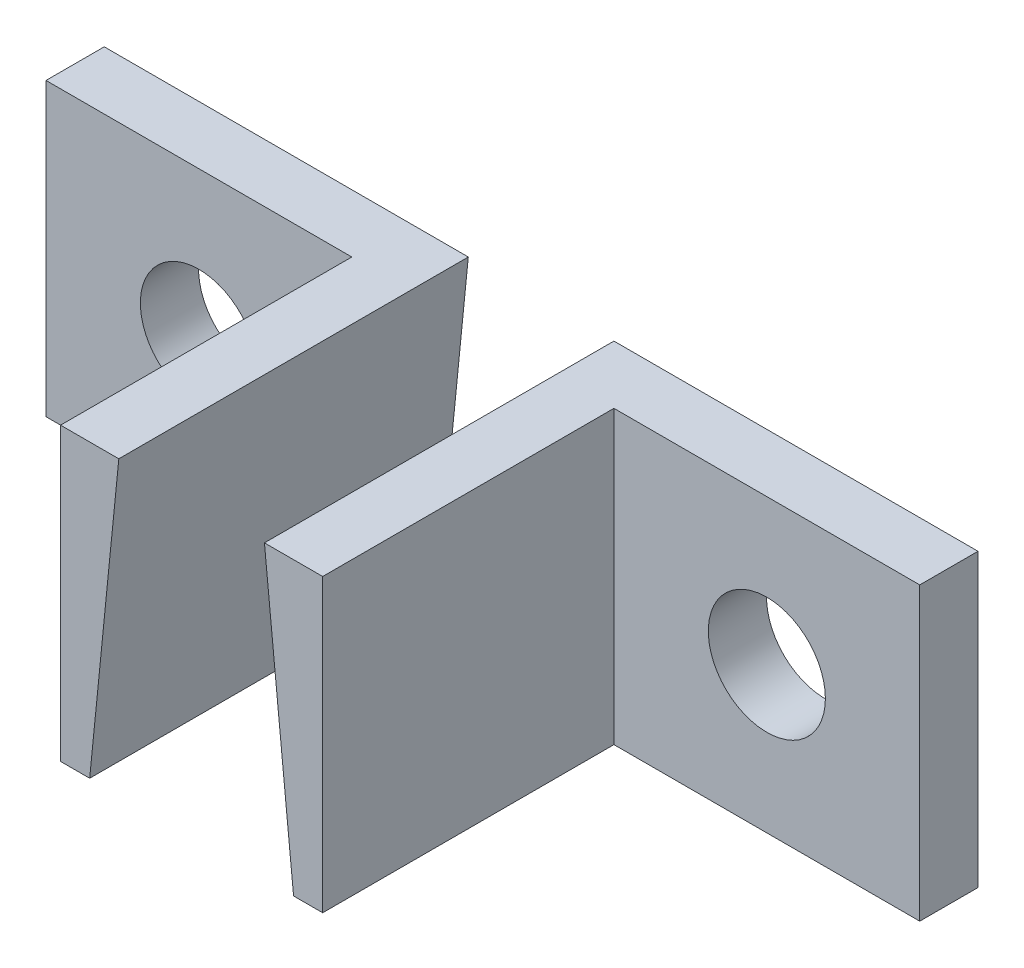
ISO-10303-21;
HEADER;
FILE_DESCRIPTION(('STEP AP214'),'2;1');
FILE_NAME('part.step','',(''),(''),'','','');
FILE_SCHEMA(('AUTOMOTIVE_DESIGN { 1 0 10303 214 1 1 1 1 }'));
ENDSEC;
DATA;
#1=APPLICATION_CONTEXT('core data for automotive mechanical design processes');
#2=APPLICATION_PROTOCOL_DEFINITION('international standard','automotive_design',2000,#1);
#3=PRODUCT_CONTEXT('',#1,'mechanical');
#4=PRODUCT('Part','Part','',(#3));
#5=PRODUCT_RELATED_PRODUCT_CATEGORY('part','',(#4));
#6=PRODUCT_DEFINITION_FORMATION('','',#4);
#7=PRODUCT_DEFINITION_CONTEXT('part definition',#1,'design');
#8=PRODUCT_DEFINITION('design','',#6,#7);
#9=PRODUCT_DEFINITION_SHAPE('','',#8);
#10=(LENGTH_UNIT() NAMED_UNIT(*) SI_UNIT(.MILLI.,.METRE.));
#11=(NAMED_UNIT(*) PLANE_ANGLE_UNIT() SI_UNIT($,.RADIAN.));
#12=(NAMED_UNIT(*) SI_UNIT($,.STERADIAN.) SOLID_ANGLE_UNIT());
#13=UNCERTAINTY_MEASURE_WITH_UNIT(LENGTH_MEASURE(1.E-05),#10,'distance_accuracy_value','');
#14=(GEOMETRIC_REPRESENTATION_CONTEXT(3) GLOBAL_UNCERTAINTY_ASSIGNED_CONTEXT((#13)) GLOBAL_UNIT_ASSIGNED_CONTEXT((#10,
#11,#12)) REPRESENTATION_CONTEXT('',''));
#15=CARTESIAN_POINT('',(0.,0.,0.));
#16=DIRECTION('',(0.,0.,1.));
#17=DIRECTION('',(1.,0.,0.));
#18=AXIS2_PLACEMENT_3D('',#15,#16,#17);
#19=CARTESIAN_POINT('',(0.,0.,0.));
#20=DIRECTION('',(0.,0.,1.));
#21=DIRECTION('',(1.,0.,0.));
#22=AXIS2_PLACEMENT_3D('',#19,#20,#21);
#23=PLANE('',#22);
#24=DIRECTION('',(-1.,0.,0.));
#25=VECTOR('',#24,1.);
#26=CARTESIAN_POINT('',(0.,12.7,0.));
#27=LINE('',#26,#25);
#28=CARTESIAN_POINT('',(-22.225,12.7,0.));
#29=VERTEX_POINT('',#28);
#30=CARTESIAN_POINT('',(-38.1,12.7,0.));
#31=VERTEX_POINT('',#30);
#32=EDGE_CURVE('E52',#29,#31,#27,.T.);
#33=ORIENTED_EDGE('',*,*,#32,.F.);
#34=DIRECTION('',(-0.0995037190209992,-0.995037190209989,0.));
#35=VECTOR('',#34,1.);
#36=CARTESIAN_POINT('',(-22.225,12.7,0.));
#37=LINE('',#36,#35);
#38=CARTESIAN_POINT('',(-23.495,0.,0.));
#39=VERTEX_POINT('',#38);
#40=EDGE_CURVE('E96',#29,#39,#37,.T.);
#41=ORIENTED_EDGE('',*,*,#40,.T.);
#42=DIRECTION('',(1.,0.,0.));
#43=VECTOR('',#42,1.);
#44=CARTESIAN_POINT('',(0.,0.,0.));
#45=LINE('',#44,#43);
#46=CARTESIAN_POINT('',(-38.1,0.,0.));
#47=VERTEX_POINT('',#46);
#48=EDGE_CURVE('E121',#47,#39,#45,.T.);
#49=ORIENTED_EDGE('',*,*,#48,.F.);
#50=DIRECTION('',(0.,-1.,0.));
#51=VECTOR('',#50,1.);
#52=CARTESIAN_POINT('',(-38.1,0.,0.));
#53=LINE('',#52,#51);
#54=EDGE_CURVE('E118',#31,#47,#53,.T.);
#55=ORIENTED_EDGE('',*,*,#54,.F.);
#56=EDGE_LOOP('',(#33,#41,#49,#55));
#57=FACE_BOUND('',#56,.T.);
#58=CARTESIAN_POINT('',(-31.4325,6.35,0.));
#59=DIRECTION('',(0.,0.,1.));
#60=DIRECTION('',(1.,0.,0.));
#61=AXIS2_PLACEMENT_3D('',#58,#59,#60);
#62=CIRCLE('',#61,2.55269999999999);
#63=CARTESIAN_POINT('',(-28.8798,6.35,0.));
#64=VERTEX_POINT('',#63);
#65=EDGE_CURVE('E162',#64,#64,#62,.F.);
#66=ORIENTED_EDGE('',*,*,#65,.F.);
#67=EDGE_LOOP('',(#66));
#68=FACE_BOUND('',#67,.T.);
#69=ADVANCED_FACE('F48',(#57,#68),#23,.F.);
#70=CARTESIAN_POINT('',(0.,12.7,2.54));
#71=DIRECTION('',(0.,-1.,0.));
#72=DIRECTION('',(1.,0.,0.));
#73=AXIS2_PLACEMENT_3D('',#70,#71,#72);
#74=PLANE('',#73);
#75=DIRECTION('',(0.,0.,-1.));
#76=VECTOR('',#75,1.);
#77=CARTESIAN_POINT('',(-22.225,12.7,15.24));
#78=LINE('',#77,#76);
#79=CARTESIAN_POINT('',(-22.225,12.7,15.24));
#80=VERTEX_POINT('',#79);
#81=EDGE_CURVE('E67',#80,#29,#78,.T.);
#82=ORIENTED_EDGE('',*,*,#81,.T.);
#83=ORIENTED_EDGE('',*,*,#32,.T.);
#84=DIRECTION('',(0.,0.,-1.));
#85=VECTOR('',#84,1.);
#86=CARTESIAN_POINT('',(-38.1,12.7,2.54));
#87=LINE('',#86,#85);
#88=CARTESIAN_POINT('',(-38.1,12.7,2.54));
#89=VERTEX_POINT('',#88);
#90=EDGE_CURVE('E131',#89,#31,#87,.T.);
#91=ORIENTED_EDGE('',*,*,#90,.F.);
#92=DIRECTION('',(-1.,0.,0.));
#93=VECTOR('',#92,1.);
#94=CARTESIAN_POINT('',(0.,12.7,2.54));
#95=LINE('',#94,#93);
#96=CARTESIAN_POINT('',(-24.765,12.7,2.54));
#97=VERTEX_POINT('',#96);
#98=EDGE_CURVE('E138',#97,#89,#95,.T.);
#99=ORIENTED_EDGE('',*,*,#98,.F.);
#100=DIRECTION('',(0.,0.,-1.));
#101=VECTOR('',#100,1.);
#102=CARTESIAN_POINT('',(-24.765,12.7,15.24));
#103=LINE('',#102,#101);
#104=CARTESIAN_POINT('',(-24.765,12.7,15.24));
#105=VERTEX_POINT('',#104);
#106=EDGE_CURVE('E12',#105,#97,#103,.T.);
#107=ORIENTED_EDGE('',*,*,#106,.F.);
#108=DIRECTION('',(1.,0.,0.));
#109=VECTOR('',#108,1.);
#110=CARTESIAN_POINT('',(-24.765,12.7,15.24));
#111=LINE('',#110,#109);
#112=EDGE_CURVE('E113',#105,#80,#111,.T.);
#113=ORIENTED_EDGE('',*,*,#112,.T.);
#114=EDGE_LOOP('',(#82,#83,#91,#99,#107,#113));
#115=FACE_BOUND('',#114,.T.);
#116=ADVANCED_FACE('F50',(#115),#74,.F.);
#117=CARTESIAN_POINT('',(0.,0.,2.54));
#118=DIRECTION('',(0.,1.,0.));
#119=DIRECTION('',(-1.,0.,0.));
#120=AXIS2_PLACEMENT_3D('',#117,#118,#119);
#121=PLANE('',#120);
#122=ORIENTED_EDGE('',*,*,#48,.T.);
#123=DIRECTION('',(0.,0.,1.));
#124=VECTOR('',#123,1.);
#125=CARTESIAN_POINT('',(-23.495,0.,0.));
#126=LINE('',#125,#124);
#127=CARTESIAN_POINT('',(-23.495,0.,15.24));
#128=VERTEX_POINT('',#127);
#129=EDGE_CURVE('E99',#39,#128,#126,.T.);
#130=ORIENTED_EDGE('',*,*,#129,.T.);
#131=DIRECTION('',(-1.,0.,0.));
#132=VECTOR('',#131,1.);
#133=CARTESIAN_POINT('',(-24.765,0.,15.24));
#134=LINE('',#133,#132);
#135=CARTESIAN_POINT('',(-24.765,0.,15.24));
#136=VERTEX_POINT('',#135);
#137=EDGE_CURVE('E124',#128,#136,#134,.T.);
#138=ORIENTED_EDGE('',*,*,#137,.T.);
#139=DIRECTION('',(0.,0.,-1.));
#140=VECTOR('',#139,1.);
#141=CARTESIAN_POINT('',(-24.765,0.,15.24));
#142=LINE('',#141,#140);
#143=CARTESIAN_POINT('',(-24.765,0.,2.54));
#144=VERTEX_POINT('',#143);
#145=EDGE_CURVE('E149',#136,#144,#142,.T.);
#146=ORIENTED_EDGE('',*,*,#145,.T.);
#147=DIRECTION('',(1.,0.,0.));
#148=VECTOR('',#147,1.);
#149=CARTESIAN_POINT('',(0.,0.,2.54));
#150=LINE('',#149,#148);
#151=CARTESIAN_POINT('',(-38.1,0.,2.54));
#152=VERTEX_POINT('',#151);
#153=EDGE_CURVE('E132',#152,#144,#150,.T.);
#154=ORIENTED_EDGE('',*,*,#153,.F.);
#155=DIRECTION('',(0.,0.,-1.));
#156=VECTOR('',#155,1.);
#157=CARTESIAN_POINT('',(-38.1,0.,2.54));
#158=LINE('',#157,#156);
#159=EDGE_CURVE('E137',#152,#47,#158,.T.);
#160=ORIENTED_EDGE('',*,*,#159,.T.);
#161=EDGE_LOOP('',(#122,#130,#138,#146,#154,#160));
#162=FACE_BOUND('',#161,.T.);
#163=ADVANCED_FACE('F179',(#162),#121,.F.);
#164=CARTESIAN_POINT('',(0.,0.,2.54));
#165=DIRECTION('',(0.,0.,1.));
#166=DIRECTION('',(1.,0.,0.));
#167=AXIS2_PLACEMENT_3D('',#164,#165,#166);
#168=PLANE('',#167);
#169=CARTESIAN_POINT('',(-31.4325,6.35,2.54));
#170=DIRECTION('',(0.,0.,1.));
#171=DIRECTION('',(1.,0.,0.));
#172=AXIS2_PLACEMENT_3D('',#169,#170,#171);
#173=CIRCLE('',#172,2.55269999999999);
#174=CARTESIAN_POINT('',(-28.8798,6.35,2.54));
#175=VERTEX_POINT('',#174);
#176=EDGE_CURVE('E164',#175,#175,#173,.T.);
#177=ORIENTED_EDGE('',*,*,#176,.F.);
#178=EDGE_LOOP('',(#177));
#179=FACE_BOUND('',#178,.T.);
#180=ORIENTED_EDGE('',*,*,#153,.T.);
#181=DIRECTION('',(0.,1.,0.));
#182=VECTOR('',#181,1.);
#183=CARTESIAN_POINT('',(-24.765,12.7,2.54));
#184=LINE('',#183,#182);
#185=EDGE_CURVE('E136',#144,#97,#184,.T.);
#186=ORIENTED_EDGE('',*,*,#185,.T.);
#187=ORIENTED_EDGE('',*,*,#98,.T.);
#188=DIRECTION('',(0.,-1.,0.));
#189=VECTOR('',#188,1.);
#190=CARTESIAN_POINT('',(-38.1,0.,2.54));
#191=LINE('',#190,#189);
#192=EDGE_CURVE('E140',#89,#152,#191,.T.);
#193=ORIENTED_EDGE('',*,*,#192,.T.);
#194=EDGE_LOOP('',(#180,#186,#187,#193));
#195=FACE_BOUND('',#194,.T.);
#196=ADVANCED_FACE('F181',(#179,#195),#168,.T.);
#197=CARTESIAN_POINT('',(-38.1,0.,2.54));
#198=DIRECTION('',(1.,0.,0.));
#199=DIRECTION('',(0.,0.,-1.));
#200=AXIS2_PLACEMENT_3D('',#197,#198,#199);
#201=PLANE('',#200);
#202=ORIENTED_EDGE('',*,*,#54,.T.);
#203=ORIENTED_EDGE('',*,*,#159,.F.);
#204=ORIENTED_EDGE('',*,*,#192,.F.);
#205=ORIENTED_EDGE('',*,*,#90,.T.);
#206=EDGE_LOOP('',(#202,#203,#204,#205));
#207=FACE_BOUND('',#206,.T.);
#208=ADVANCED_FACE('F188',(#207),#201,.F.);
#209=CARTESIAN_POINT('',(-24.765,12.7,15.24));
#210=DIRECTION('',(-1.,0.,0.));
#211=DIRECTION('',(0.,-1.,0.));
#212=AXIS2_PLACEMENT_3D('',#209,#210,#211);
#213=PLANE('',#212);
#214=ORIENTED_EDGE('',*,*,#185,.F.);
#215=ORIENTED_EDGE('',*,*,#145,.F.);
#216=DIRECTION('',(0.,1.,0.));
#217=VECTOR('',#216,1.);
#218=CARTESIAN_POINT('',(-24.765,12.7,15.24));
#219=LINE('',#218,#217);
#220=EDGE_CURVE('E59',#136,#105,#219,.T.);
#221=ORIENTED_EDGE('',*,*,#220,.T.);
#222=ORIENTED_EDGE('',*,*,#106,.T.);
#223=EDGE_LOOP('',(#214,#215,#221,#222));
#224=FACE_BOUND('',#223,.T.);
#225=ADVANCED_FACE('F200',(#224),#213,.T.);
#226=CARTESIAN_POINT('',(0.,0.,15.24));
#227=DIRECTION('',(0.,0.,1.));
#228=DIRECTION('',(1.,0.,0.));
#229=AXIS2_PLACEMENT_3D('',#226,#227,#228);
#230=PLANE('',#229);
#231=DIRECTION('',(-0.0995037190209992,-0.995037190209989,0.));
#232=VECTOR('',#231,1.);
#233=CARTESIAN_POINT('',(-22.225,12.7,15.24));
#234=LINE('',#233,#232);
#235=EDGE_CURVE('E105',#80,#128,#234,.T.);
#236=ORIENTED_EDGE('',*,*,#235,.F.);
#237=ORIENTED_EDGE('',*,*,#112,.F.);
#238=ORIENTED_EDGE('',*,*,#220,.F.);
#239=ORIENTED_EDGE('',*,*,#137,.F.);
#240=EDGE_LOOP('',(#236,#237,#238,#239));
#241=FACE_BOUND('',#240,.T.);
#242=ADVANCED_FACE('F198',(#241),#230,.T.);
#243=CARTESIAN_POINT('',(-22.225,12.7,0.));
#244=DIRECTION('',(-0.995037190209989,0.0995037190209992,0.));
#245=DIRECTION('',(-0.0995037190209992,-0.995037190209989,0.));
#246=AXIS2_PLACEMENT_3D('',#243,#244,#245);
#247=PLANE('',#246);
#248=ORIENTED_EDGE('',*,*,#235,.T.);
#249=ORIENTED_EDGE('',*,*,#129,.F.);
#250=ORIENTED_EDGE('',*,*,#40,.F.);
#251=ORIENTED_EDGE('',*,*,#81,.F.);
#252=EDGE_LOOP('',(#248,#249,#250,#251));
#253=FACE_BOUND('',#252,.T.);
#254=ADVANCED_FACE('F97',(#253),#247,.F.);
#255=CARTESIAN_POINT('',(-31.4325,6.35,2.54));
#256=DIRECTION('',(0.,0.,1.));
#257=DIRECTION('',(1.,0.,0.));
#258=AXIS2_PLACEMENT_3D('',#255,#256,#257);
#259=CYLINDRICAL_SURFACE('',#258,2.55269999999999);
#260=ORIENTED_EDGE('',*,*,#65,.T.);
#261=EDGE_LOOP('',(#260));
#262=FACE_BOUND('',#261,.T.);
#263=ORIENTED_EDGE('',*,*,#176,.T.);
#264=EDGE_LOOP('',(#263));
#265=FACE_BOUND('',#264,.T.);
#266=ADVANCED_FACE('F172',(#262,#265),#259,.F.);
#267=CLOSED_SHELL('',(#69,#116,#163,#196,#208,#225,#242,#254,#266));
#268=MANIFOLD_SOLID_BREP('B2',#267);
#269=CARTESIAN_POINT('',(-13.335,12.7,15.24));
#270=DIRECTION('',(1.,0.,0.));
#271=DIRECTION('',(0.,0.,-1.));
#272=AXIS2_PLACEMENT_3D('',#269,#270,#271);
#273=PLANE('',#272);
#274=DIRECTION('',(0.,-1.,0.));
#275=VECTOR('',#274,1.);
#276=CARTESIAN_POINT('',(-13.335,12.7,2.54));
#277=LINE('',#276,#275);
#278=CARTESIAN_POINT('',(-13.335,12.7,2.54));
#279=VERTEX_POINT('',#278);
#280=CARTESIAN_POINT('',(-13.335,0.,2.54));
#281=VERTEX_POINT('',#280);
#282=EDGE_CURVE('E345',#279,#281,#277,.T.);
#283=ORIENTED_EDGE('',*,*,#282,.F.);
#284=DIRECTION('',(0.,0.,-1.));
#285=VECTOR('',#284,1.);
#286=CARTESIAN_POINT('',(-13.335,12.7,15.24));
#287=LINE('',#286,#285);
#288=CARTESIAN_POINT('',(-13.335,12.7,15.24));
#289=VERTEX_POINT('',#288);
#290=EDGE_CURVE('E334',#289,#279,#287,.T.);
#291=ORIENTED_EDGE('',*,*,#290,.F.);
#292=DIRECTION('',(0.,-1.,0.));
#293=VECTOR('',#292,1.);
#294=CARTESIAN_POINT('',(-13.335,12.7,15.24));
#295=LINE('',#294,#293);
#296=CARTESIAN_POINT('',(-13.335,0.,15.24));
#297=VERTEX_POINT('',#296);
#298=EDGE_CURVE('E349',#289,#297,#295,.T.);
#299=ORIENTED_EDGE('',*,*,#298,.T.);
#300=DIRECTION('',(0.,0.,-1.));
#301=VECTOR('',#300,1.);
#302=CARTESIAN_POINT('',(-13.335,0.,15.24));
#303=LINE('',#302,#301);
#304=EDGE_CURVE('E330',#297,#281,#303,.T.);
#305=ORIENTED_EDGE('',*,*,#304,.T.);
#306=EDGE_LOOP('',(#283,#291,#299,#305));
#307=FACE_BOUND('',#306,.T.);
#308=ADVANCED_FACE('F276',(#307),#273,.T.);
#309=CARTESIAN_POINT('',(0.,0.,2.54));
#310=DIRECTION('',(0.,0.,1.));
#311=DIRECTION('',(1.,0.,0.));
#312=AXIS2_PLACEMENT_3D('',#309,#310,#311);
#313=PLANE('',#312);
#314=CARTESIAN_POINT('',(-6.6675,6.35,2.54));
#315=DIRECTION('',(0.,0.,1.));
#316=DIRECTION('',(1.,0.,0.));
#317=AXIS2_PLACEMENT_3D('',#314,#315,#316);
#318=CIRCLE('',#317,2.55269999999999);
#319=CARTESIAN_POINT('',(-4.11480000000001,6.35,2.54));
#320=VERTEX_POINT('',#319);
#321=EDGE_CURVE('E363',#320,#320,#318,.T.);
#322=ORIENTED_EDGE('',*,*,#321,.F.);
#323=EDGE_LOOP('',(#322));
#324=FACE_BOUND('',#323,.T.);
#325=ORIENTED_EDGE('',*,*,#282,.T.);
#326=DIRECTION('',(1.,0.,0.));
#327=VECTOR('',#326,1.);
#328=CARTESIAN_POINT('',(0.,0.,2.54));
#329=LINE('',#328,#327);
#330=CARTESIAN_POINT('',(0.,0.,2.54));
#331=VERTEX_POINT('',#330);
#332=EDGE_CURVE('E297',#281,#331,#329,.T.);
#333=ORIENTED_EDGE('',*,*,#332,.T.);
#334=DIRECTION('',(0.,1.,0.));
#335=VECTOR('',#334,1.);
#336=CARTESIAN_POINT('',(0.,0.,2.54));
#337=LINE('',#336,#335);
#338=CARTESIAN_POINT('',(0.,12.7,2.54));
#339=VERTEX_POINT('',#338);
#340=EDGE_CURVE('E321',#331,#339,#337,.T.);
#341=ORIENTED_EDGE('',*,*,#340,.T.);
#342=DIRECTION('',(-1.,0.,0.));
#343=VECTOR('',#342,1.);
#344=CARTESIAN_POINT('',(0.,12.7,2.54));
#345=LINE('',#344,#343);
#346=EDGE_CURVE('E291',#339,#279,#345,.T.);
#347=ORIENTED_EDGE('',*,*,#346,.T.);
#348=EDGE_LOOP('',(#325,#333,#341,#347));
#349=FACE_BOUND('',#348,.T.);
#350=ADVANCED_FACE('F369',(#324,#349),#313,.T.);
#351=CARTESIAN_POINT('',(0.,0.,2.54));
#352=DIRECTION('',(-1.,0.,0.));
#353=DIRECTION('',(0.,-1.,0.));
#354=AXIS2_PLACEMENT_3D('',#351,#352,#353);
#355=PLANE('',#354);
#356=DIRECTION('',(0.,1.,0.));
#357=VECTOR('',#356,1.);
#358=CARTESIAN_POINT('',(0.,0.,0.));
#359=LINE('',#358,#357);
#360=CARTESIAN_POINT('',(0.,0.,0.));
#361=VERTEX_POINT('',#360);
#362=CARTESIAN_POINT('',(0.,12.7,0.));
#363=VERTEX_POINT('',#362);
#364=EDGE_CURVE('E327',#361,#363,#359,.T.);
#365=ORIENTED_EDGE('',*,*,#364,.T.);
#366=DIRECTION('',(0.,0.,-1.));
#367=VECTOR('',#366,1.);
#368=CARTESIAN_POINT('',(0.,12.7,2.54));
#369=LINE('',#368,#367);
#370=EDGE_CURVE('E46',#339,#363,#369,.T.);
#371=ORIENTED_EDGE('',*,*,#370,.F.);
#372=ORIENTED_EDGE('',*,*,#340,.F.);
#373=DIRECTION('',(0.,0.,-1.));
#374=VECTOR('',#373,1.);
#375=CARTESIAN_POINT('',(0.,0.,2.54));
#376=LINE('',#375,#374);
#377=EDGE_CURVE('E284',#331,#361,#376,.T.);
#378=ORIENTED_EDGE('',*,*,#377,.T.);
#379=EDGE_LOOP('',(#365,#371,#372,#378));
#380=FACE_BOUND('',#379,.T.);
#381=ADVANCED_FACE('F278',(#380),#355,.F.);
#382=CARTESIAN_POINT('',(0.,0.,15.24));
#383=DIRECTION('',(0.,0.,1.));
#384=DIRECTION('',(1.,0.,0.));
#385=AXIS2_PLACEMENT_3D('',#382,#383,#384);
#386=PLANE('',#385);
#387=DIRECTION('',(-0.0995037190209986,0.995037190209989,0.));
#388=VECTOR('',#387,1.);
#389=CARTESIAN_POINT('',(-15.875,12.7,15.24));
#390=LINE('',#389,#388);
#391=CARTESIAN_POINT('',(-14.605,0.,15.24));
#392=VERTEX_POINT('',#391);
#393=CARTESIAN_POINT('',(-15.875,12.7,15.24));
#394=VERTEX_POINT('',#393);
#395=EDGE_CURVE('E356',#392,#394,#390,.T.);
#396=ORIENTED_EDGE('',*,*,#395,.F.);
#397=DIRECTION('',(-1.,0.,0.));
#398=VECTOR('',#397,1.);
#399=CARTESIAN_POINT('',(-15.875,0.,15.24));
#400=LINE('',#399,#398);
#401=EDGE_CURVE('E343',#297,#392,#400,.T.);
#402=ORIENTED_EDGE('',*,*,#401,.F.);
#403=ORIENTED_EDGE('',*,*,#298,.F.);
#404=DIRECTION('',(1.,0.,0.));
#405=VECTOR('',#404,1.);
#406=CARTESIAN_POINT('',(-15.875,12.7,15.24));
#407=LINE('',#406,#405);
#408=EDGE_CURVE('E347',#394,#289,#407,.T.);
#409=ORIENTED_EDGE('',*,*,#408,.F.);
#410=EDGE_LOOP('',(#396,#402,#403,#409));
#411=FACE_BOUND('',#410,.T.);
#412=ADVANCED_FACE('F398',(#411),#386,.T.);
#413=CARTESIAN_POINT('',(0.,0.,0.));
#414=DIRECTION('',(0.,0.,1.));
#415=DIRECTION('',(1.,0.,0.));
#416=AXIS2_PLACEMENT_3D('',#413,#414,#415);
#417=PLANE('',#416);
#418=CARTESIAN_POINT('',(-6.6675,6.35,0.));
#419=DIRECTION('',(0.,0.,1.));
#420=DIRECTION('',(1.,0.,0.));
#421=AXIS2_PLACEMENT_3D('',#418,#419,#420);
#422=CIRCLE('',#421,2.5527);
#423=CARTESIAN_POINT('',(-4.1148,6.35,0.));
#424=VERTEX_POINT('',#423);
#425=EDGE_CURVE('E359',#424,#424,#422,.T.);
#426=ORIENTED_EDGE('',*,*,#425,.T.);
#427=EDGE_LOOP('',(#426));
#428=FACE_BOUND('',#427,.T.);
#429=DIRECTION('',(1.,0.,0.));
#430=VECTOR('',#429,1.);
#431=CARTESIAN_POINT('',(0.,0.,0.));
#432=LINE('',#431,#430);
#433=CARTESIAN_POINT('',(-14.605,0.,0.));
#434=VERTEX_POINT('',#433);
#435=EDGE_CURVE('E310',#434,#361,#432,.T.);
#436=ORIENTED_EDGE('',*,*,#435,.F.);
#437=DIRECTION('',(-0.0995037190209986,0.995037190209989,0.));
#438=VECTOR('',#437,1.);
#439=CARTESIAN_POINT('',(-15.875,12.7,0.));
#440=LINE('',#439,#438);
#441=CARTESIAN_POINT('',(-15.875,12.7,0.));
#442=VERTEX_POINT('',#441);
#443=EDGE_CURVE('E355',#434,#442,#440,.T.);
#444=ORIENTED_EDGE('',*,*,#443,.T.);
#445=DIRECTION('',(-1.,0.,0.));
#446=VECTOR('',#445,1.);
#447=CARTESIAN_POINT('',(0.,12.7,0.));
#448=LINE('',#447,#446);
#449=EDGE_CURVE('E322',#363,#442,#448,.T.);
#450=ORIENTED_EDGE('',*,*,#449,.F.);
#451=ORIENTED_EDGE('',*,*,#364,.F.);
#452=EDGE_LOOP('',(#436,#444,#450,#451));
#453=FACE_BOUND('',#452,.T.);
#454=ADVANCED_FACE('F328',(#428,#453),#417,.F.);
#455=CARTESIAN_POINT('',(0.,0.,2.54));
#456=DIRECTION('',(0.,1.,0.));
#457=DIRECTION('',(-1.,0.,0.));
#458=AXIS2_PLACEMENT_3D('',#455,#456,#457);
#459=PLANE('',#458);
#460=ORIENTED_EDGE('',*,*,#401,.T.);
#461=DIRECTION('',(0.,0.,1.));
#462=VECTOR('',#461,1.);
#463=CARTESIAN_POINT('',(-14.605,0.,0.));
#464=LINE('',#463,#462);
#465=EDGE_CURVE('E317',#434,#392,#464,.T.);
#466=ORIENTED_EDGE('',*,*,#465,.F.);
#467=ORIENTED_EDGE('',*,*,#435,.T.);
#468=ORIENTED_EDGE('',*,*,#377,.F.);
#469=ORIENTED_EDGE('',*,*,#332,.F.);
#470=ORIENTED_EDGE('',*,*,#304,.F.);
#471=EDGE_LOOP('',(#460,#466,#467,#468,#469,#470));
#472=FACE_BOUND('',#471,.T.);
#473=ADVANCED_FACE('F313',(#472),#459,.F.);
#474=CARTESIAN_POINT('',(0.,12.7,2.54));
#475=DIRECTION('',(0.,-1.,0.));
#476=DIRECTION('',(1.,0.,0.));
#477=AXIS2_PLACEMENT_3D('',#474,#475,#476);
#478=PLANE('',#477);
#479=ORIENTED_EDGE('',*,*,#449,.T.);
#480=DIRECTION('',(0.,0.,-1.));
#481=VECTOR('',#480,1.);
#482=CARTESIAN_POINT('',(-15.875,12.7,15.24));
#483=LINE('',#482,#481);
#484=EDGE_CURVE('E340',#394,#442,#483,.T.);
#485=ORIENTED_EDGE('',*,*,#484,.F.);
#486=ORIENTED_EDGE('',*,*,#408,.T.);
#487=ORIENTED_EDGE('',*,*,#290,.T.);
#488=ORIENTED_EDGE('',*,*,#346,.F.);
#489=ORIENTED_EDGE('',*,*,#370,.T.);
#490=EDGE_LOOP('',(#479,#485,#486,#487,#488,#489));
#491=FACE_BOUND('',#490,.T.);
#492=ADVANCED_FACE('F395',(#491),#478,.F.);
#493=CARTESIAN_POINT('',(-15.875,12.7,0.));
#494=DIRECTION('',(0.995037190209989,0.0995037190209986,0.));
#495=DIRECTION('',(-0.0995037190209987,0.995037190209989,0.));
#496=AXIS2_PLACEMENT_3D('',#493,#494,#495);
#497=PLANE('',#496);
#498=ORIENTED_EDGE('',*,*,#395,.T.);
#499=ORIENTED_EDGE('',*,*,#484,.T.);
#500=ORIENTED_EDGE('',*,*,#443,.F.);
#501=ORIENTED_EDGE('',*,*,#465,.T.);
#502=EDGE_LOOP('',(#498,#499,#500,#501));
#503=FACE_BOUND('',#502,.T.);
#504=ADVANCED_FACE('F391',(#503),#497,.F.);
#505=CARTESIAN_POINT('',(-6.6675,6.35,2.54));
#506=DIRECTION('',(0.,0.,1.));
#507=DIRECTION('',(1.,0.,0.));
#508=AXIS2_PLACEMENT_3D('',#505,#506,#507);
#509=CYLINDRICAL_SURFACE('',#508,2.55269999999999);
#510=ORIENTED_EDGE('',*,*,#425,.F.);
#511=EDGE_LOOP('',(#510));
#512=FACE_BOUND('',#511,.T.);
#513=ORIENTED_EDGE('',*,*,#321,.T.);
#514=EDGE_LOOP('',(#513));
#515=FACE_BOUND('',#514,.T.);
#516=ADVANCED_FACE('F367',(#512,#515),#509,.F.);
#517=CLOSED_SHELL('',(#308,#350,#381,#412,#454,#473,#492,#504,#516));
#518=MANIFOLD_SOLID_BREP('B6',#517);
#519=ADVANCED_BREP_SHAPE_REPRESENTATION('',(#18,#268,#518),#14);
#520=SHAPE_DEFINITION_REPRESENTATION(#9,#519);
ENDSEC;
END-ISO-10303-21;
